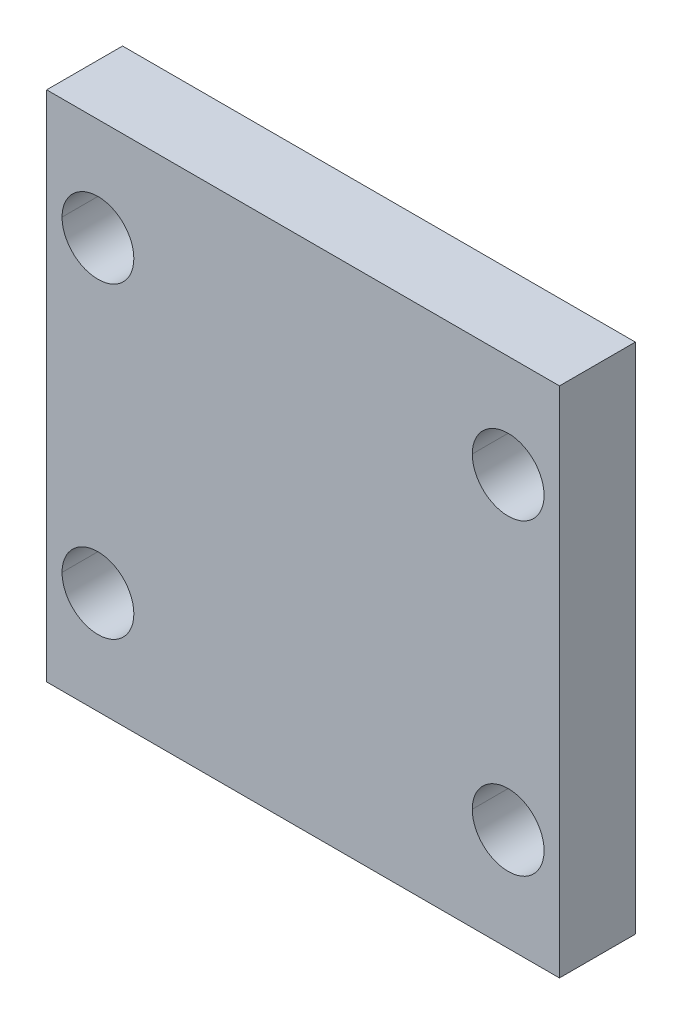
ISO-10303-21;
HEADER;
FILE_DESCRIPTION(('STEP AP214'),'2;1');
FILE_NAME('part.step','',(''),(''),'','','');
FILE_SCHEMA(('AUTOMOTIVE_DESIGN { 1 0 10303 214 1 1 1 1 }'));
ENDSEC;
DATA;
#1=APPLICATION_CONTEXT('core data for automotive mechanical design processes');
#2=APPLICATION_PROTOCOL_DEFINITION('international standard','automotive_design',2000,#1);
#3=PRODUCT_CONTEXT('',#1,'mechanical');
#4=PRODUCT('Part','Part','',(#3));
#5=PRODUCT_RELATED_PRODUCT_CATEGORY('part','',(#4));
#6=PRODUCT_DEFINITION_FORMATION('','',#4);
#7=PRODUCT_DEFINITION_CONTEXT('part definition',#1,'design');
#8=PRODUCT_DEFINITION('design','',#6,#7);
#9=PRODUCT_DEFINITION_SHAPE('','',#8);
#10=(LENGTH_UNIT() NAMED_UNIT(*) SI_UNIT(.MILLI.,.METRE.));
#11=(NAMED_UNIT(*) PLANE_ANGLE_UNIT() SI_UNIT($,.RADIAN.));
#12=(NAMED_UNIT(*) SI_UNIT($,.STERADIAN.) SOLID_ANGLE_UNIT());
#13=UNCERTAINTY_MEASURE_WITH_UNIT(LENGTH_MEASURE(1.E-05),#10,'distance_accuracy_value','');
#14=(GEOMETRIC_REPRESENTATION_CONTEXT(3) GLOBAL_UNCERTAINTY_ASSIGNED_CONTEXT((#13)) GLOBAL_UNIT_ASSIGNED_CONTEXT((#10,
#11,#12)) REPRESENTATION_CONTEXT('',''));
#15=CARTESIAN_POINT('',(0.,0.,0.));
#16=DIRECTION('',(0.,0.,1.));
#17=DIRECTION('',(1.,0.,0.));
#18=AXIS2_PLACEMENT_3D('',#15,#16,#17);
#19=CARTESIAN_POINT('',(0.,0.,0.));
#20=DIRECTION('',(0.,0.,1.));
#21=DIRECTION('',(1.,0.,0.));
#22=AXIS2_PLACEMENT_3D('',#19,#20,#21);
#23=PLANE('',#22);
#24=CARTESIAN_POINT('',(-10.,-7.5,0.));
#25=DIRECTION('',(0.,0.,1.));
#26=DIRECTION('',(1.,0.,0.));
#27=AXIS2_PLACEMENT_3D('',#24,#25,#26);
#28=CIRCLE('',#27,1.75);
#29=CARTESIAN_POINT('',(-11.75,-7.5,0.));
#30=VERTEX_POINT('',#29);
#31=CARTESIAN_POINT('',(-8.25,-7.5,0.));
#32=VERTEX_POINT('',#31);
#33=EDGE_CURVE('E169',#30,#32,#28,.T.);
#34=ORIENTED_EDGE('',*,*,#33,.T.);
#35=CARTESIAN_POINT('',(-10.,-7.5,0.));
#36=DIRECTION('',(0.,0.,1.));
#37=DIRECTION('',(1.,0.,0.));
#38=AXIS2_PLACEMENT_3D('',#35,#36,#37);
#39=CIRCLE('',#38,1.75);
#40=EDGE_CURVE('E200',#32,#30,#39,.T.);
#41=ORIENTED_EDGE('',*,*,#40,.T.);
#42=EDGE_LOOP('',(#34,#41));
#43=FACE_BOUND('',#42,.T.);
#44=CARTESIAN_POINT('',(10.,7.5,0.));
#45=DIRECTION('',(0.,0.,1.));
#46=DIRECTION('',(1.,0.,0.));
#47=AXIS2_PLACEMENT_3D('',#44,#45,#46);
#48=CIRCLE('',#47,1.75);
#49=CARTESIAN_POINT('',(8.25,7.5,0.));
#50=VERTEX_POINT('',#49);
#51=CARTESIAN_POINT('',(11.75,7.5,0.));
#52=VERTEX_POINT('',#51);
#53=EDGE_CURVE('E192',#50,#52,#48,.T.);
#54=ORIENTED_EDGE('',*,*,#53,.T.);
#55=CARTESIAN_POINT('',(10.,7.5,0.));
#56=DIRECTION('',(0.,0.,1.));
#57=DIRECTION('',(1.,0.,0.));
#58=AXIS2_PLACEMENT_3D('',#55,#56,#57);
#59=CIRCLE('',#58,1.75);
#60=EDGE_CURVE('E164',#52,#50,#59,.T.);
#61=ORIENTED_EDGE('',*,*,#60,.T.);
#62=EDGE_LOOP('',(#54,#61));
#63=FACE_BOUND('',#62,.T.);
#64=CARTESIAN_POINT('',(-10.,7.5,0.));
#65=DIRECTION('',(0.,0.,1.));
#66=DIRECTION('',(1.,0.,0.));
#67=AXIS2_PLACEMENT_3D('',#64,#65,#66);
#68=CIRCLE('',#67,1.75);
#69=CARTESIAN_POINT('',(-11.75,7.5,0.));
#70=VERTEX_POINT('',#69);
#71=CARTESIAN_POINT('',(-8.25,7.5,0.));
#72=VERTEX_POINT('',#71);
#73=EDGE_CURVE('E178',#70,#72,#68,.T.);
#74=ORIENTED_EDGE('',*,*,#73,.T.);
#75=CARTESIAN_POINT('',(-10.,7.5,0.));
#76=DIRECTION('',(0.,0.,1.));
#77=DIRECTION('',(1.,0.,0.));
#78=AXIS2_PLACEMENT_3D('',#75,#76,#77);
#79=CIRCLE('',#78,1.75);
#80=EDGE_CURVE('E202',#72,#70,#79,.T.);
#81=ORIENTED_EDGE('',*,*,#80,.T.);
#82=EDGE_LOOP('',(#74,#81));
#83=FACE_BOUND('',#82,.T.);
#84=CARTESIAN_POINT('',(10.,-7.5,0.));
#85=DIRECTION('',(0.,0.,1.));
#86=DIRECTION('',(1.,0.,0.));
#87=AXIS2_PLACEMENT_3D('',#84,#85,#86);
#88=CIRCLE('',#87,1.75);
#89=CARTESIAN_POINT('',(8.25,-7.5,0.));
#90=VERTEX_POINT('',#89);
#91=CARTESIAN_POINT('',(11.75,-7.5,0.));
#92=VERTEX_POINT('',#91);
#93=EDGE_CURVE('E137',#90,#92,#88,.T.);
#94=ORIENTED_EDGE('',*,*,#93,.T.);
#95=CARTESIAN_POINT('',(10.,-7.5,0.));
#96=DIRECTION('',(0.,0.,1.));
#97=DIRECTION('',(1.,0.,0.));
#98=AXIS2_PLACEMENT_3D('',#95,#96,#97);
#99=CIRCLE('',#98,1.75);
#100=EDGE_CURVE('E133',#92,#90,#99,.T.);
#101=ORIENTED_EDGE('',*,*,#100,.T.);
#102=EDGE_LOOP('',(#94,#101));
#103=FACE_BOUND('',#102,.T.);
#104=DIRECTION('',(1.,0.,0.));
#105=VECTOR('',#104,1.);
#106=CARTESIAN_POINT('',(0.,-12.5,0.));
#107=LINE('',#106,#105);
#108=CARTESIAN_POINT('',(-12.5,-12.5,0.));
#109=VERTEX_POINT('',#108);
#110=CARTESIAN_POINT('',(12.5,-12.5,0.));
#111=VERTEX_POINT('',#110);
#112=EDGE_CURVE('E210',#109,#111,#107,.T.);
#113=ORIENTED_EDGE('',*,*,#112,.F.);
#114=DIRECTION('',(0.,1.,0.));
#115=VECTOR('',#114,1.);
#116=CARTESIAN_POINT('',(-12.5,0.,0.));
#117=LINE('',#116,#115);
#118=CARTESIAN_POINT('',(-12.5,12.5,0.));
#119=VERTEX_POINT('',#118);
#120=EDGE_CURVE('E27',#109,#119,#117,.T.);
#121=ORIENTED_EDGE('',*,*,#120,.T.);
#122=DIRECTION('',(1.,0.,0.));
#123=VECTOR('',#122,1.);
#124=CARTESIAN_POINT('',(0.,12.5,0.));
#125=LINE('',#124,#123);
#126=CARTESIAN_POINT('',(12.5,12.5,0.));
#127=VERTEX_POINT('',#126);
#128=EDGE_CURVE('E206',#119,#127,#125,.T.);
#129=ORIENTED_EDGE('',*,*,#128,.T.);
#130=DIRECTION('',(0.,1.,0.));
#131=VECTOR('',#130,1.);
#132=CARTESIAN_POINT('',(12.5,0.,0.));
#133=LINE('',#132,#131);
#134=EDGE_CURVE('E239',#111,#127,#133,.T.);
#135=ORIENTED_EDGE('',*,*,#134,.F.);
#136=EDGE_LOOP('',(#113,#121,#129,#135));
#137=FACE_BOUND('',#136,.T.);
#138=ADVANCED_FACE('F16',(#43,#63,#83,#103,#137),#23,.F.);
#139=CARTESIAN_POINT('',(0.,0.,3.7));
#140=DIRECTION('',(0.,0.,1.));
#141=DIRECTION('',(1.,0.,0.));
#142=AXIS2_PLACEMENT_3D('',#139,#140,#141);
#143=PLANE('',#142);
#144=CARTESIAN_POINT('',(-10.,-7.5,3.7));
#145=DIRECTION('',(0.,0.,1.));
#146=DIRECTION('',(1.,0.,0.));
#147=AXIS2_PLACEMENT_3D('',#144,#145,#146);
#148=CIRCLE('',#147,1.75);
#149=CARTESIAN_POINT('',(-11.75,-7.5,3.7));
#150=VERTEX_POINT('',#149);
#151=CARTESIAN_POINT('',(-8.25,-7.5,3.7));
#152=VERTEX_POINT('',#151);
#153=EDGE_CURVE('E20',#150,#152,#148,.T.);
#154=ORIENTED_EDGE('',*,*,#153,.F.);
#155=CARTESIAN_POINT('',(-10.,-7.5,3.7));
#156=DIRECTION('',(0.,0.,1.));
#157=DIRECTION('',(1.,0.,0.));
#158=AXIS2_PLACEMENT_3D('',#155,#156,#157);
#159=CIRCLE('',#158,1.75);
#160=EDGE_CURVE('E196',#152,#150,#159,.T.);
#161=ORIENTED_EDGE('',*,*,#160,.F.);
#162=EDGE_LOOP('',(#154,#161));
#163=FACE_BOUND('',#162,.T.);
#164=CARTESIAN_POINT('',(10.,7.5,3.7));
#165=DIRECTION('',(0.,0.,1.));
#166=DIRECTION('',(1.,0.,0.));
#167=AXIS2_PLACEMENT_3D('',#164,#165,#166);
#168=CIRCLE('',#167,1.75);
#169=CARTESIAN_POINT('',(8.25,7.5,3.7));
#170=VERTEX_POINT('',#169);
#171=CARTESIAN_POINT('',(11.75,7.5,3.7));
#172=VERTEX_POINT('',#171);
#173=EDGE_CURVE('E234',#170,#172,#168,.T.);
#174=ORIENTED_EDGE('',*,*,#173,.F.);
#175=CARTESIAN_POINT('',(10.,7.5,3.7));
#176=DIRECTION('',(0.,0.,1.));
#177=DIRECTION('',(1.,0.,0.));
#178=AXIS2_PLACEMENT_3D('',#175,#176,#177);
#179=CIRCLE('',#178,1.75);
#180=EDGE_CURVE('E207',#172,#170,#179,.T.);
#181=ORIENTED_EDGE('',*,*,#180,.F.);
#182=EDGE_LOOP('',(#174,#181));
#183=FACE_BOUND('',#182,.T.);
#184=CARTESIAN_POINT('',(-10.,7.5,3.7));
#185=DIRECTION('',(0.,0.,1.));
#186=DIRECTION('',(1.,0.,0.));
#187=AXIS2_PLACEMENT_3D('',#184,#185,#186);
#188=CIRCLE('',#187,1.75);
#189=CARTESIAN_POINT('',(-11.75,7.5,3.7));
#190=VERTEX_POINT('',#189);
#191=CARTESIAN_POINT('',(-8.25,7.5,3.7));
#192=VERTEX_POINT('',#191);
#193=EDGE_CURVE('E151',#190,#192,#188,.T.);
#194=ORIENTED_EDGE('',*,*,#193,.F.);
#195=CARTESIAN_POINT('',(-10.,7.5,3.7));
#196=DIRECTION('',(0.,0.,1.));
#197=DIRECTION('',(1.,0.,0.));
#198=AXIS2_PLACEMENT_3D('',#195,#196,#197);
#199=CIRCLE('',#198,1.75);
#200=EDGE_CURVE('E125',#192,#190,#199,.T.);
#201=ORIENTED_EDGE('',*,*,#200,.F.);
#202=EDGE_LOOP('',(#194,#201));
#203=FACE_BOUND('',#202,.T.);
#204=CARTESIAN_POINT('',(10.,-7.5,3.7));
#205=DIRECTION('',(0.,0.,1.));
#206=DIRECTION('',(1.,0.,0.));
#207=AXIS2_PLACEMENT_3D('',#204,#205,#206);
#208=CIRCLE('',#207,1.75);
#209=CARTESIAN_POINT('',(8.25,-7.5,3.7));
#210=VERTEX_POINT('',#209);
#211=CARTESIAN_POINT('',(11.75,-7.5,3.7));
#212=VERTEX_POINT('',#211);
#213=EDGE_CURVE('E160',#210,#212,#208,.T.);
#214=ORIENTED_EDGE('',*,*,#213,.F.);
#215=CARTESIAN_POINT('',(10.,-7.5,3.7));
#216=DIRECTION('',(0.,0.,1.));
#217=DIRECTION('',(1.,0.,0.));
#218=AXIS2_PLACEMENT_3D('',#215,#216,#217);
#219=CIRCLE('',#218,1.75);
#220=EDGE_CURVE('E142',#212,#210,#219,.T.);
#221=ORIENTED_EDGE('',*,*,#220,.F.);
#222=EDGE_LOOP('',(#214,#221));
#223=FACE_BOUND('',#222,.T.);
#224=DIRECTION('',(1.,0.,0.));
#225=VECTOR('',#224,1.);
#226=CARTESIAN_POINT('',(0.,-12.5,3.7));
#227=LINE('',#226,#225);
#228=CARTESIAN_POINT('',(-12.5,-12.5,3.7));
#229=VERTEX_POINT('',#228);
#230=CARTESIAN_POINT('',(12.5,-12.5,3.7));
#231=VERTEX_POINT('',#230);
#232=EDGE_CURVE('E219',#229,#231,#227,.T.);
#233=ORIENTED_EDGE('',*,*,#232,.T.);
#234=DIRECTION('',(0.,1.,0.));
#235=VECTOR('',#234,1.);
#236=CARTESIAN_POINT('',(12.5,0.,3.7));
#237=LINE('',#236,#235);
#238=CARTESIAN_POINT('',(12.5,12.5,3.7));
#239=VERTEX_POINT('',#238);
#240=EDGE_CURVE('E323',#231,#239,#237,.T.);
#241=ORIENTED_EDGE('',*,*,#240,.T.);
#242=DIRECTION('',(1.,0.,0.));
#243=VECTOR('',#242,1.);
#244=CARTESIAN_POINT('',(0.,12.5,3.7));
#245=LINE('',#244,#243);
#246=CARTESIAN_POINT('',(-12.5,12.5,3.7));
#247=VERTEX_POINT('',#246);
#248=EDGE_CURVE('E193',#247,#239,#245,.T.);
#249=ORIENTED_EDGE('',*,*,#248,.F.);
#250=DIRECTION('',(0.,1.,0.));
#251=VECTOR('',#250,1.);
#252=CARTESIAN_POINT('',(-12.5,0.,3.7));
#253=LINE('',#252,#251);
#254=EDGE_CURVE('E10',#229,#247,#253,.T.);
#255=ORIENTED_EDGE('',*,*,#254,.F.);
#256=EDGE_LOOP('',(#233,#241,#249,#255));
#257=FACE_BOUND('',#256,.T.);
#258=ADVANCED_FACE('F263',(#163,#183,#203,#223,#257),#143,.T.);
#259=CARTESIAN_POINT('',(-12.5,0.,3.7));
#260=DIRECTION('',(-1.,0.,0.));
#261=DIRECTION('',(0.,0.,1.));
#262=AXIS2_PLACEMENT_3D('',#259,#260,#261);
#263=PLANE('',#262);
#264=ORIENTED_EDGE('',*,*,#120,.F.);
#265=DIRECTION('',(0.,0.,-1.));
#266=VECTOR('',#265,1.);
#267=CARTESIAN_POINT('',(-12.5,-12.5,3.7));
#268=LINE('',#267,#266);
#269=EDGE_CURVE('E235',#229,#109,#268,.T.);
#270=ORIENTED_EDGE('',*,*,#269,.F.);
#271=ORIENTED_EDGE('',*,*,#254,.T.);
#272=DIRECTION('',(0.,0.,-1.));
#273=VECTOR('',#272,1.);
#274=CARTESIAN_POINT('',(-12.5,12.5,3.7));
#275=LINE('',#274,#273);
#276=EDGE_CURVE('E197',#247,#119,#275,.T.);
#277=ORIENTED_EDGE('',*,*,#276,.T.);
#278=EDGE_LOOP('',(#264,#270,#271,#277));
#279=FACE_BOUND('',#278,.T.);
#280=ADVANCED_FACE('F284',(#279),#263,.T.);
#281=CARTESIAN_POINT('',(10.,-7.5,3.7));
#282=DIRECTION('',(0.,0.,-1.));
#283=DIRECTION('',(-1.,0.,0.));
#284=AXIS2_PLACEMENT_3D('',#281,#282,#283);
#285=CYLINDRICAL_SURFACE('',#284,1.75);
#286=DIRECTION('',(0.,0.,-1.));
#287=VECTOR('',#286,1.);
#288=CARTESIAN_POINT('',(11.75,-7.5,3.7));
#289=LINE('',#288,#287);
#290=EDGE_CURVE('E154',#212,#92,#289,.T.);
#291=ORIENTED_EDGE('',*,*,#290,.F.);
#292=ORIENTED_EDGE('',*,*,#220,.T.);
#293=DIRECTION('',(0.,0.,-1.));
#294=VECTOR('',#293,1.);
#295=CARTESIAN_POINT('',(8.25,-7.5,3.7));
#296=LINE('',#295,#294);
#297=EDGE_CURVE('E145',#210,#90,#296,.T.);
#298=ORIENTED_EDGE('',*,*,#297,.T.);
#299=ORIENTED_EDGE('',*,*,#100,.F.);
#300=EDGE_LOOP('',(#291,#292,#298,#299));
#301=FACE_BOUND('',#300,.T.);
#302=ADVANCED_FACE('F146',(#301),#285,.F.);
#303=CARTESIAN_POINT('',(-10.,7.5,3.7));
#304=DIRECTION('',(0.,0.,-1.));
#305=DIRECTION('',(-1.,0.,0.));
#306=AXIS2_PLACEMENT_3D('',#303,#304,#305);
#307=CYLINDRICAL_SURFACE('',#306,1.75);
#308=DIRECTION('',(0.,0.,-1.));
#309=VECTOR('',#308,1.);
#310=CARTESIAN_POINT('',(-8.25,7.5,3.7));
#311=LINE('',#310,#309);
#312=EDGE_CURVE('E172',#192,#72,#311,.T.);
#313=ORIENTED_EDGE('',*,*,#312,.F.);
#314=ORIENTED_EDGE('',*,*,#200,.T.);
#315=DIRECTION('',(0.,0.,-1.));
#316=VECTOR('',#315,1.);
#317=CARTESIAN_POINT('',(-11.75,7.5,3.7));
#318=LINE('',#317,#316);
#319=EDGE_CURVE('E184',#190,#70,#318,.T.);
#320=ORIENTED_EDGE('',*,*,#319,.T.);
#321=ORIENTED_EDGE('',*,*,#80,.F.);
#322=EDGE_LOOP('',(#313,#314,#320,#321));
#323=FACE_BOUND('',#322,.T.);
#324=ADVANCED_FACE('F273',(#323),#307,.F.);
#325=CARTESIAN_POINT('',(10.,7.5,3.7));
#326=DIRECTION('',(0.,0.,-1.));
#327=DIRECTION('',(-1.,0.,0.));
#328=AXIS2_PLACEMENT_3D('',#325,#326,#327);
#329=CYLINDRICAL_SURFACE('',#328,1.75);
#330=DIRECTION('',(0.,0.,-1.));
#331=VECTOR('',#330,1.);
#332=CARTESIAN_POINT('',(11.75,7.5,3.7));
#333=LINE('',#332,#331);
#334=EDGE_CURVE('E225',#172,#52,#333,.T.);
#335=ORIENTED_EDGE('',*,*,#334,.F.);
#336=ORIENTED_EDGE('',*,*,#180,.T.);
#337=DIRECTION('',(0.,0.,-1.));
#338=VECTOR('',#337,1.);
#339=CARTESIAN_POINT('',(8.25,7.5,3.7));
#340=LINE('',#339,#338);
#341=EDGE_CURVE('E188',#170,#50,#340,.T.);
#342=ORIENTED_EDGE('',*,*,#341,.T.);
#343=ORIENTED_EDGE('',*,*,#60,.F.);
#344=EDGE_LOOP('',(#335,#336,#342,#343));
#345=FACE_BOUND('',#344,.T.);
#346=ADVANCED_FACE('F275',(#345),#329,.F.);
#347=CARTESIAN_POINT('',(-10.,-7.5,3.7));
#348=DIRECTION('',(0.,0.,-1.));
#349=DIRECTION('',(-1.,0.,0.));
#350=AXIS2_PLACEMENT_3D('',#347,#348,#349);
#351=CYLINDRICAL_SURFACE('',#350,1.75);
#352=DIRECTION('',(0.,0.,-1.));
#353=VECTOR('',#352,1.);
#354=CARTESIAN_POINT('',(-8.25,-7.5,3.7));
#355=LINE('',#354,#353);
#356=EDGE_CURVE('E166',#152,#32,#355,.T.);
#357=ORIENTED_EDGE('',*,*,#356,.F.);
#358=ORIENTED_EDGE('',*,*,#160,.T.);
#359=DIRECTION('',(0.,0.,-1.));
#360=VECTOR('',#359,1.);
#361=CARTESIAN_POINT('',(-11.75,-7.5,3.7));
#362=LINE('',#361,#360);
#363=EDGE_CURVE('E214',#150,#30,#362,.T.);
#364=ORIENTED_EDGE('',*,*,#363,.T.);
#365=ORIENTED_EDGE('',*,*,#40,.F.);
#366=EDGE_LOOP('',(#357,#358,#364,#365));
#367=FACE_BOUND('',#366,.T.);
#368=ADVANCED_FACE('F18',(#367),#351,.F.);
#369=CARTESIAN_POINT('',(0.,12.5,3.7));
#370=DIRECTION('',(0.,1.,0.));
#371=DIRECTION('',(1.,0.,0.));
#372=AXIS2_PLACEMENT_3D('',#369,#370,#371);
#373=PLANE('',#372);
#374=ORIENTED_EDGE('',*,*,#128,.F.);
#375=ORIENTED_EDGE('',*,*,#276,.F.);
#376=ORIENTED_EDGE('',*,*,#248,.T.);
#377=DIRECTION('',(0.,0.,-1.));
#378=VECTOR('',#377,1.);
#379=CARTESIAN_POINT('',(12.5,12.5,3.7));
#380=LINE('',#379,#378);
#381=EDGE_CURVE('E243',#239,#127,#380,.T.);
#382=ORIENTED_EDGE('',*,*,#381,.T.);
#383=EDGE_LOOP('',(#374,#375,#376,#382));
#384=FACE_BOUND('',#383,.T.);
#385=ADVANCED_FACE('F308',(#384),#373,.T.);
#386=CARTESIAN_POINT('',(12.5,0.,3.7));
#387=DIRECTION('',(-1.,0.,0.));
#388=DIRECTION('',(0.,0.,1.));
#389=AXIS2_PLACEMENT_3D('',#386,#387,#388);
#390=PLANE('',#389);
#391=ORIENTED_EDGE('',*,*,#134,.T.);
#392=ORIENTED_EDGE('',*,*,#381,.F.);
#393=ORIENTED_EDGE('',*,*,#240,.F.);
#394=DIRECTION('',(0.,0.,-1.));
#395=VECTOR('',#394,1.);
#396=CARTESIAN_POINT('',(12.5,-12.5,3.7));
#397=LINE('',#396,#395);
#398=EDGE_CURVE('E213',#231,#111,#397,.T.);
#399=ORIENTED_EDGE('',*,*,#398,.T.);
#400=EDGE_LOOP('',(#391,#392,#393,#399));
#401=FACE_BOUND('',#400,.T.);
#402=ADVANCED_FACE('F302',(#401),#390,.F.);
#403=CARTESIAN_POINT('',(0.,-12.5,3.7));
#404=DIRECTION('',(0.,1.,0.));
#405=DIRECTION('',(1.,0.,0.));
#406=AXIS2_PLACEMENT_3D('',#403,#404,#405);
#407=PLANE('',#406);
#408=ORIENTED_EDGE('',*,*,#112,.T.);
#409=ORIENTED_EDGE('',*,*,#398,.F.);
#410=ORIENTED_EDGE('',*,*,#232,.F.);
#411=ORIENTED_EDGE('',*,*,#269,.T.);
#412=EDGE_LOOP('',(#408,#409,#410,#411));
#413=FACE_BOUND('',#412,.T.);
#414=ADVANCED_FACE('F295',(#413),#407,.F.);
#415=CARTESIAN_POINT('',(-10.,-7.5,3.7));
#416=DIRECTION('',(0.,0.,-1.));
#417=DIRECTION('',(-1.,0.,0.));
#418=AXIS2_PLACEMENT_3D('',#415,#416,#417);
#419=CYLINDRICAL_SURFACE('',#418,1.75);
#420=ORIENTED_EDGE('',*,*,#153,.T.);
#421=ORIENTED_EDGE('',*,*,#356,.T.);
#422=ORIENTED_EDGE('',*,*,#33,.F.);
#423=ORIENTED_EDGE('',*,*,#363,.F.);
#424=EDGE_LOOP('',(#420,#421,#422,#423));
#425=FACE_BOUND('',#424,.T.);
#426=ADVANCED_FACE('F259',(#425),#419,.F.);
#427=CARTESIAN_POINT('',(10.,7.5,3.7));
#428=DIRECTION('',(0.,0.,-1.));
#429=DIRECTION('',(-1.,0.,0.));
#430=AXIS2_PLACEMENT_3D('',#427,#428,#429);
#431=CYLINDRICAL_SURFACE('',#430,1.75);
#432=ORIENTED_EDGE('',*,*,#173,.T.);
#433=ORIENTED_EDGE('',*,*,#334,.T.);
#434=ORIENTED_EDGE('',*,*,#53,.F.);
#435=ORIENTED_EDGE('',*,*,#341,.F.);
#436=EDGE_LOOP('',(#432,#433,#434,#435));
#437=FACE_BOUND('',#436,.T.);
#438=ADVANCED_FACE('F294',(#437),#431,.F.);
#439=CARTESIAN_POINT('',(-10.,7.5,3.7));
#440=DIRECTION('',(0.,0.,-1.));
#441=DIRECTION('',(-1.,0.,0.));
#442=AXIS2_PLACEMENT_3D('',#439,#440,#441);
#443=CYLINDRICAL_SURFACE('',#442,1.75);
#444=ORIENTED_EDGE('',*,*,#193,.T.);
#445=ORIENTED_EDGE('',*,*,#312,.T.);
#446=ORIENTED_EDGE('',*,*,#73,.F.);
#447=ORIENTED_EDGE('',*,*,#319,.F.);
#448=EDGE_LOOP('',(#444,#445,#446,#447));
#449=FACE_BOUND('',#448,.T.);
#450=ADVANCED_FACE('F268',(#449),#443,.F.);
#451=CARTESIAN_POINT('',(10.,-7.5,3.7));
#452=DIRECTION('',(0.,0.,-1.));
#453=DIRECTION('',(-1.,0.,0.));
#454=AXIS2_PLACEMENT_3D('',#451,#452,#453);
#455=CYLINDRICAL_SURFACE('',#454,1.75);
#456=ORIENTED_EDGE('',*,*,#213,.T.);
#457=ORIENTED_EDGE('',*,*,#290,.T.);
#458=ORIENTED_EDGE('',*,*,#93,.F.);
#459=ORIENTED_EDGE('',*,*,#297,.F.);
#460=EDGE_LOOP('',(#456,#457,#458,#459));
#461=FACE_BOUND('',#460,.T.);
#462=ADVANCED_FACE('F153',(#461),#455,.F.);
#463=CLOSED_SHELL('',(#138,#258,#280,#302,#324,#346,#368,#385,#402,#414,#426,#438,#450,#462));
#464=MANIFOLD_SOLID_BREP('B1',#463);
#465=ADVANCED_BREP_SHAPE_REPRESENTATION('',(#18,#464),#14);
#466=SHAPE_DEFINITION_REPRESENTATION(#9,#465);
ENDSEC;
END-ISO-10303-21;
